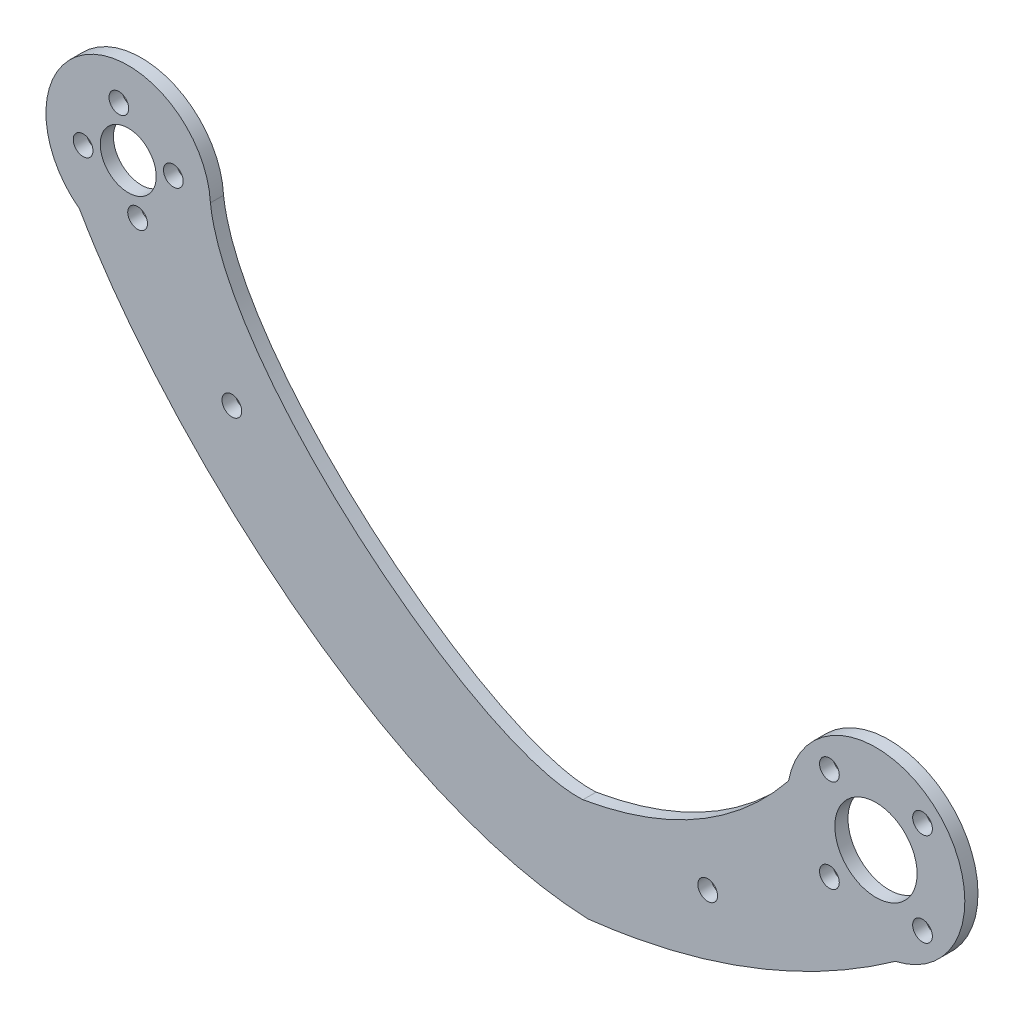
ISO-10303-21;
HEADER;
FILE_DESCRIPTION(('STEP AP214'),'2;1');
FILE_NAME('part.step','',(''),(''),'','','');
FILE_SCHEMA(('AUTOMOTIVE_DESIGN { 1 0 10303 214 1 1 1 1 }'));
ENDSEC;
DATA;
#1=APPLICATION_CONTEXT('core data for automotive mechanical design processes');
#2=APPLICATION_PROTOCOL_DEFINITION('international standard','automotive_design',2000,#1);
#3=PRODUCT_CONTEXT('',#1,'mechanical');
#4=PRODUCT('Part','Part','',(#3));
#5=PRODUCT_RELATED_PRODUCT_CATEGORY('part','',(#4));
#6=PRODUCT_DEFINITION_FORMATION('','',#4);
#7=PRODUCT_DEFINITION_CONTEXT('part definition',#1,'design');
#8=PRODUCT_DEFINITION('design','',#6,#7);
#9=PRODUCT_DEFINITION_SHAPE('','',#8);
#10=(LENGTH_UNIT() NAMED_UNIT(*) SI_UNIT(.MILLI.,.METRE.));
#11=(NAMED_UNIT(*) PLANE_ANGLE_UNIT() SI_UNIT($,.RADIAN.));
#12=(NAMED_UNIT(*) SI_UNIT($,.STERADIAN.) SOLID_ANGLE_UNIT());
#13=UNCERTAINTY_MEASURE_WITH_UNIT(LENGTH_MEASURE(1.E-05),#10,'distance_accuracy_value','');
#14=(GEOMETRIC_REPRESENTATION_CONTEXT(3) GLOBAL_UNCERTAINTY_ASSIGNED_CONTEXT((#13)) GLOBAL_UNIT_ASSIGNED_CONTEXT((#10,
#11,#12)) REPRESENTATION_CONTEXT('',''));
#15=CARTESIAN_POINT('',(0.,0.,0.));
#16=DIRECTION('',(0.,0.,1.));
#17=DIRECTION('',(1.,0.,0.));
#18=AXIS2_PLACEMENT_3D('',#15,#16,#17);
#19=CARTESIAN_POINT('',(5.89271121734806,-11.0238811000908,2.));
#20=CARTESIAN_POINT('',(-16.2082829222259,-27.8197472460681,2.));
#21=CARTESIAN_POINT('',(-43.7150317978709,-30.941916125743,2.));
#22=B_SPLINE_CURVE_WITH_KNOTS('',2,(#19,#20,#21),.UNSPECIFIED.,.F.,.F.,(3,3),(0.,1.),.UNSPECIFIED.);
#23=DIRECTION('',(0.,0.,-1.));
#24=VECTOR('',#23,1.);
#25=SURFACE_OF_LINEAR_EXTRUSION('',#22,#24);
#26=CARTESIAN_POINT('',(5.89271121734806,-11.0238811000908,0.));
#27=CARTESIAN_POINT('',(-16.2082829222259,-27.8197472460681,0.));
#28=CARTESIAN_POINT('',(-43.7150317978709,-30.941916125743,0.));
#29=B_SPLINE_CURVE_WITH_KNOTS('',2,(#26,#27,#28),.UNSPECIFIED.,.F.,.F.,(3,3),(0.,1.),.UNSPECIFIED.);
#30=CARTESIAN_POINT('',(2.96847581375117,-13.169591920146,0.));
#31=VERTEX_POINT('',#30);
#32=CARTESIAN_POINT('',(-43.7150317978709,-30.941916125743,0.));
#33=VERTEX_POINT('',#32);
#34=EDGE_CURVE('E145',#31,#33,#29,.T.);
#35=ORIENTED_EDGE('',*,*,#34,.F.);
#36=DIRECTION('',(0.,0.,-1.));
#37=VECTOR('',#36,1.);
#38=CARTESIAN_POINT('',(2.96847581375117,-13.169591920146,2.));
#39=LINE('',#38,#37);
#40=CARTESIAN_POINT('',(2.96847581375117,-13.169591920146,2.));
#41=VERTEX_POINT('',#40);
#42=EDGE_CURVE('E11',#41,#31,#39,.T.);
#43=ORIENTED_EDGE('',*,*,#42,.F.);
#44=CARTESIAN_POINT('',(-43.7150317978709,-30.941916125743,2.));
#45=VERTEX_POINT('',#44);
#46=EDGE_CURVE('E177',#41,#45,#22,.T.);
#47=ORIENTED_EDGE('',*,*,#46,.T.);
#48=DIRECTION('',(0.,0.,-1.));
#49=VECTOR('',#48,1.);
#50=CARTESIAN_POINT('',(-43.7150317978709,-30.941916125743,2.));
#51=LINE('',#50,#49);
#52=EDGE_CURVE('E67',#45,#33,#51,.T.);
#53=ORIENTED_EDGE('',*,*,#52,.T.);
#54=EDGE_LOOP('',(#35,#43,#47,#53));
#55=FACE_BOUND('',#54,.T.);
#56=ADVANCED_FACE('F49',(#55),#25,.T.);
#57=CARTESIAN_POINT('',(0.,0.,2.));
#58=DIRECTION('',(0.,0.,-1.));
#59=DIRECTION('',(-1.,0.,0.));
#60=AXIS2_PLACEMENT_3D('',#57,#58,#59);
#61=CYLINDRICAL_SURFACE('',#60,13.5);
#62=CARTESIAN_POINT('',(0.,0.,0.));
#63=DIRECTION('',(0.,0.,1.));
#64=DIRECTION('',(1.,0.,0.));
#65=AXIS2_PLACEMENT_3D('',#62,#63,#64);
#66=CIRCLE('',#65,13.5);
#67=CARTESIAN_POINT('',(-13.2764107451434,2.44681787762002,0.));
#68=VERTEX_POINT('',#67);
#69=EDGE_CURVE('E325',#31,#68,#66,.T.);
#70=ORIENTED_EDGE('',*,*,#69,.T.);
#71=DIRECTION('',(0.,0.,-1.));
#72=VECTOR('',#71,1.);
#73=CARTESIAN_POINT('',(-13.2764107451434,2.44681787762002,2.));
#74=LINE('',#73,#72);
#75=CARTESIAN_POINT('',(-13.2764107451434,2.44681787762002,2.));
#76=VERTEX_POINT('',#75);
#77=EDGE_CURVE('E59',#76,#68,#74,.T.);
#78=ORIENTED_EDGE('',*,*,#77,.F.);
#79=CARTESIAN_POINT('',(0.,0.,2.));
#80=DIRECTION('',(0.,0.,1.));
#81=DIRECTION('',(1.,0.,0.));
#82=AXIS2_PLACEMENT_3D('',#79,#80,#81);
#83=CIRCLE('',#82,13.5);
#84=EDGE_CURVE('E172',#41,#76,#83,.T.);
#85=ORIENTED_EDGE('',*,*,#84,.F.);
#86=ORIENTED_EDGE('',*,*,#42,.T.);
#87=EDGE_LOOP('',(#70,#78,#85,#86));
#88=FACE_BOUND('',#87,.T.);
#89=ADVANCED_FACE('F165',(#88),#61,.T.);
#90=CARTESIAN_POINT('',(-44.5148949759072,-15.6481190292885,2.));
#91=CARTESIAN_POINT('',(-23.7549924871948,-12.0499323994041,2.));
#92=CARTESIAN_POINT('',(-11.6175816478134,4.61321977109147,2.));
#93=B_SPLINE_CURVE_WITH_KNOTS('',2,(#90,#91,#92),.UNSPECIFIED.,.F.,.F.,(3,3),(0.,1.),.UNSPECIFIED.);
#94=DIRECTION('',(0.,0.,-1.));
#95=VECTOR('',#94,1.);
#96=SURFACE_OF_LINEAR_EXTRUSION('',#93,#95);
#97=CARTESIAN_POINT('',(-44.5148949759072,-15.6481190292885,0.));
#98=CARTESIAN_POINT('',(-23.7549924871948,-12.0499323994041,0.));
#99=CARTESIAN_POINT('',(-11.6175816478134,4.61321977109147,0.));
#100=B_SPLINE_CURVE_WITH_KNOTS('',2,(#97,#98,#99),.UNSPECIFIED.,.F.,.F.,(3,3),(0.,1.),.UNSPECIFIED.);
#101=CARTESIAN_POINT('',(-44.5148949759072,-15.6481190292885,0.));
#102=VERTEX_POINT('',#101);
#103=EDGE_CURVE('E349',#102,#68,#100,.T.);
#104=ORIENTED_EDGE('',*,*,#103,.F.);
#105=DIRECTION('',(0.,0.,-1.));
#106=VECTOR('',#105,1.);
#107=CARTESIAN_POINT('',(-44.5148949759072,-15.6481190292885,2.));
#108=LINE('',#107,#106);
#109=CARTESIAN_POINT('',(-44.5148949759072,-15.6481190292885,2.));
#110=VERTEX_POINT('',#109);
#111=EDGE_CURVE('E126',#110,#102,#108,.T.);
#112=ORIENTED_EDGE('',*,*,#111,.F.);
#113=EDGE_CURVE('E114',#110,#76,#93,.T.);
#114=ORIENTED_EDGE('',*,*,#113,.T.);
#115=ORIENTED_EDGE('',*,*,#77,.T.);
#116=EDGE_LOOP('',(#104,#112,#114,#115));
#117=FACE_BOUND('',#116,.T.);
#118=ADVANCED_FACE('F163',(#117),#96,.T.);
#119=CARTESIAN_POINT('',(-44.5148949759072,-15.6481190292885,2.));
#120=CARTESIAN_POINT('',(-60.4932461919799,-16.6209660956188,2.));
#121=CARTESIAN_POINT('',(-98.7193744847428,13.9940161599674,2.));
#122=CARTESIAN_POINT('',(-101.09932332728,34.5772843276964,2.));
#123=B_SPLINE_CURVE_WITH_KNOTS('',3,(#119,#120,#121,#122),.UNSPECIFIED.,.F.,.F.,(4,4),(0.,1.),.UNSPECIFIED.);
#124=DIRECTION('',(0.,0.,-1.));
#125=VECTOR('',#124,1.);
#126=SURFACE_OF_LINEAR_EXTRUSION('',#123,#125);
#127=CARTESIAN_POINT('',(-44.5148949759072,-15.6481190292885,0.));
#128=CARTESIAN_POINT('',(-60.4932461919799,-16.6209660956188,0.));
#129=CARTESIAN_POINT('',(-98.7193744847428,13.9940161599674,0.));
#130=CARTESIAN_POINT('',(-101.09932332728,34.5772843276964,0.));
#131=B_SPLINE_CURVE_WITH_KNOTS('',3,(#127,#128,#129,#130),.UNSPECIFIED.,.F.,.F.,(4,4),(0.,1.),.UNSPECIFIED.);
#132=CARTESIAN_POINT('',(-101.09932332728,34.5772843276964,0.));
#133=VERTEX_POINT('',#132);
#134=EDGE_CURVE('E122',#102,#133,#131,.T.);
#135=ORIENTED_EDGE('',*,*,#134,.T.);
#136=DIRECTION('',(0.,0.,-1.));
#137=VECTOR('',#136,1.);
#138=CARTESIAN_POINT('',(-101.09932332728,34.5772843276964,2.));
#139=LINE('',#138,#137);
#140=CARTESIAN_POINT('',(-101.09932332728,34.5772843276964,2.));
#141=VERTEX_POINT('',#140);
#142=EDGE_CURVE('E119',#141,#133,#139,.T.);
#143=ORIENTED_EDGE('',*,*,#142,.F.);
#144=EDGE_CURVE('E106',#110,#141,#123,.T.);
#145=ORIENTED_EDGE('',*,*,#144,.F.);
#146=ORIENTED_EDGE('',*,*,#111,.T.);
#147=EDGE_LOOP('',(#135,#143,#145,#146));
#148=FACE_BOUND('',#147,.T.);
#149=ADVANCED_FACE('F120',(#148),#126,.F.);
#150=CARTESIAN_POINT('',(-113.582262858622,33.92442855736,2.));
#151=DIRECTION('',(0.,0.,-1.));
#152=DIRECTION('',(-1.,0.,0.));
#153=AXIS2_PLACEMENT_3D('',#150,#151,#152);
#154=CYLINDRICAL_SURFACE('',#153,12.5);
#155=CARTESIAN_POINT('',(-113.582262858622,33.92442855736,0.));
#156=DIRECTION('',(0.,0.,1.));
#157=DIRECTION('',(1.,0.,0.));
#158=AXIS2_PLACEMENT_3D('',#155,#156,#157);
#159=CIRCLE('',#158,12.5);
#160=CARTESIAN_POINT('',(-120.988196927905,23.8545655711311,0.));
#161=VERTEX_POINT('',#160);
#162=EDGE_CURVE('E328',#133,#161,#159,.T.);
#163=ORIENTED_EDGE('',*,*,#162,.T.);
#164=DIRECTION('',(0.,0.,-1.));
#165=VECTOR('',#164,1.);
#166=CARTESIAN_POINT('',(-120.988196927905,23.8545655711311,2.));
#167=LINE('',#166,#165);
#168=CARTESIAN_POINT('',(-120.988196927905,23.8545655711311,2.));
#169=VERTEX_POINT('',#168);
#170=EDGE_CURVE('E87',#169,#161,#167,.T.);
#171=ORIENTED_EDGE('',*,*,#170,.F.);
#172=CARTESIAN_POINT('',(-113.582262858622,33.92442855736,2.));
#173=DIRECTION('',(0.,0.,1.));
#174=DIRECTION('',(1.,0.,0.));
#175=AXIS2_PLACEMENT_3D('',#172,#173,#174);
#176=CIRCLE('',#175,12.5);
#177=EDGE_CURVE('E112',#141,#169,#176,.T.);
#178=ORIENTED_EDGE('',*,*,#177,.F.);
#179=ORIENTED_EDGE('',*,*,#142,.T.);
#180=EDGE_LOOP('',(#163,#171,#178,#179));
#181=FACE_BOUND('',#180,.T.);
#182=ADVANCED_FACE('F128',(#181),#154,.T.);
#183=CARTESIAN_POINT('',(-43.7150317978709,-30.941916125743,2.));
#184=CARTESIAN_POINT('',(-74.6558875999215,-29.7721762631503,2.));
#185=CARTESIAN_POINT('',(-107.934743733726,0.909272839135125,2.));
#186=CARTESIAN_POINT('',(-120.988196927905,23.8545655711311,2.));
#187=B_SPLINE_CURVE_WITH_KNOTS('',3,(#183,#184,#185,#186),.UNSPECIFIED.,.F.,.F.,(4,4),(0.,1.),.UNSPECIFIED.);
#188=DIRECTION('',(0.,0.,-1.));
#189=VECTOR('',#188,1.);
#190=SURFACE_OF_LINEAR_EXTRUSION('',#187,#189);
#191=CARTESIAN_POINT('',(-43.7150317978709,-30.941916125743,0.));
#192=CARTESIAN_POINT('',(-74.6558875999215,-29.7721762631503,0.));
#193=CARTESIAN_POINT('',(-107.934743733726,0.909272839135125,0.));
#194=CARTESIAN_POINT('',(-120.988196927905,23.8545655711311,0.));
#195=B_SPLINE_CURVE_WITH_KNOTS('',3,(#191,#192,#193,#194),.UNSPECIFIED.,.F.,.F.,(4,4),(0.,1.),.UNSPECIFIED.);
#196=EDGE_CURVE('E183',#33,#161,#195,.T.);
#197=ORIENTED_EDGE('',*,*,#196,.F.);
#198=ORIENTED_EDGE('',*,*,#52,.F.);
#199=EDGE_CURVE('E130',#45,#169,#187,.T.);
#200=ORIENTED_EDGE('',*,*,#199,.T.);
#201=ORIENTED_EDGE('',*,*,#170,.T.);
#202=EDGE_LOOP('',(#197,#198,#200,#201));
#203=FACE_BOUND('',#202,.T.);
#204=ADVANCED_FACE('F153',(#203),#190,.T.);
#205=CARTESIAN_POINT('',(0.,0.,2.));
#206=DIRECTION('',(0.,0.,1.));
#207=DIRECTION('',(1.,0.,0.));
#208=AXIS2_PLACEMENT_3D('',#205,#206,#207);
#209=PLANE('',#208);
#210=CARTESIAN_POINT('',(-97.8402350611844,9.54296842905933,2.));
#211=DIRECTION('',(0.,0.,1.));
#212=DIRECTION('',(1.,0.,0.));
#213=AXIS2_PLACEMENT_3D('',#210,#211,#212);
#214=CIRCLE('',#213,1.5);
#215=CARTESIAN_POINT('',(-96.3402350611844,9.54296842905933,2.));
#216=VERTEX_POINT('',#215);
#217=EDGE_CURVE('E201',#216,#216,#214,.T.);
#218=ORIENTED_EDGE('',*,*,#217,.F.);
#219=EDGE_LOOP('',(#218));
#220=FACE_BOUND('',#219,.T.);
#221=CARTESIAN_POINT('',(-25.5617243230472,-18.0513040104756,2.));
#222=DIRECTION('',(0.,0.,1.));
#223=DIRECTION('',(1.,0.,0.));
#224=AXIS2_PLACEMENT_3D('',#221,#222,#223);
#225=CIRCLE('',#224,1.5);
#226=CARTESIAN_POINT('',(-24.0617243230472,-18.0513040104756,2.));
#227=VERTEX_POINT('',#226);
#228=EDGE_CURVE('E267',#227,#227,#225,.T.);
#229=ORIENTED_EDGE('',*,*,#228,.F.);
#230=EDGE_LOOP('',(#229));
#231=FACE_BOUND('',#230,.T.);
#232=CARTESIAN_POINT('',(-120.435814162853,32.5000569344794,2.));
#233=DIRECTION('',(0.,0.,1.));
#234=DIRECTION('',(1.,0.,0.));
#235=AXIS2_PLACEMENT_3D('',#232,#233,#234);
#236=CIRCLE('',#235,1.5);
#237=CARTESIAN_POINT('',(-118.935814162853,32.5000569344794,2.));
#238=VERTEX_POINT('',#237);
#239=EDGE_CURVE('E196',#238,#238,#236,.T.);
#240=ORIENTED_EDGE('',*,*,#239,.F.);
#241=EDGE_LOOP('',(#240));
#242=FACE_BOUND('',#241,.T.);
#243=CARTESIAN_POINT('',(-7.07106781186529,7.07106781186637,2.));
#244=DIRECTION('',(0.,0.,1.));
#245=DIRECTION('',(1.,0.,0.));
#246=AXIS2_PLACEMENT_3D('',#243,#244,#245);
#247=CIRCLE('',#246,1.5);
#248=CARTESIAN_POINT('',(-5.57106781186529,7.07106781186637,2.));
#249=VERTEX_POINT('',#248);
#250=EDGE_CURVE('E230',#249,#249,#247,.T.);
#251=ORIENTED_EDGE('',*,*,#250,.F.);
#252=EDGE_LOOP('',(#251));
#253=FACE_BOUND('',#252,.T.);
#254=CARTESIAN_POINT('',(-113.582262858607,33.9244285573589,2.));
#255=DIRECTION('',(0.,0.,1.));
#256=DIRECTION('',(1.,0.,0.));
#257=AXIS2_PLACEMENT_3D('',#254,#255,#256);
#258=CIRCLE('',#257,4.24999999999548);
#259=CARTESIAN_POINT('',(-109.332262858612,33.9244285573589,2.));
#260=VERTEX_POINT('',#259);
#261=EDGE_CURVE('E222',#260,#260,#258,.T.);
#262=ORIENTED_EDGE('',*,*,#261,.F.);
#263=EDGE_LOOP('',(#262));
#264=FACE_BOUND('',#263,.T.);
#265=CARTESIAN_POINT('',(7.07106781186566,7.07106781186629,2.));
#266=DIRECTION('',(0.,0.,1.));
#267=DIRECTION('',(1.,0.,0.));
#268=AXIS2_PLACEMENT_3D('',#265,#266,#267);
#269=CIRCLE('',#268,1.5);
#270=CARTESIAN_POINT('',(8.57106781186566,7.07106781186629,2.));
#271=VERTEX_POINT('',#270);
#272=EDGE_CURVE('E214',#271,#271,#269,.T.);
#273=ORIENTED_EDGE('',*,*,#272,.F.);
#274=EDGE_LOOP('',(#273));
#275=FACE_BOUND('',#274,.T.);
#276=CARTESIAN_POINT('',(7.07106781186539,-7.07106781186556,2.));
#277=DIRECTION('',(0.,0.,1.));
#278=DIRECTION('',(1.,0.,0.));
#279=AXIS2_PLACEMENT_3D('',#276,#277,#278);
#280=CIRCLE('',#279,1.5);
#281=CARTESIAN_POINT('',(8.57106781186539,-7.07106781186556,2.));
#282=VERTEX_POINT('',#281);
#283=EDGE_CURVE('E205',#282,#282,#280,.T.);
#284=ORIENTED_EDGE('',*,*,#283,.F.);
#285=EDGE_LOOP('',(#284));
#286=FACE_BOUND('',#285,.T.);
#287=CARTESIAN_POINT('',(-7.07106781186559,-7.07106781186536,2.));
#288=DIRECTION('',(0.,0.,1.));
#289=DIRECTION('',(1.,0.,0.));
#290=AXIS2_PLACEMENT_3D('',#287,#288,#289);
#291=CIRCLE('',#290,1.5);
#292=CARTESIAN_POINT('',(-5.57106781186559,-7.07106781186536,2.));
#293=VERTEX_POINT('',#292);
#294=EDGE_CURVE('E260',#293,#293,#291,.T.);
#295=ORIENTED_EDGE('',*,*,#294,.F.);
#296=EDGE_LOOP('',(#295));
#297=FACE_BOUND('',#296,.T.);
#298=CARTESIAN_POINT('',(-106.728711554361,35.3488001802385,2.));
#299=DIRECTION('',(0.,0.,1.));
#300=DIRECTION('',(1.,0.,0.));
#301=AXIS2_PLACEMENT_3D('',#298,#299,#300);
#302=CIRCLE('',#301,1.5);
#303=CARTESIAN_POINT('',(-105.228711554361,35.3488001802385,2.));
#304=VERTEX_POINT('',#303);
#305=EDGE_CURVE('E252',#304,#304,#302,.T.);
#306=ORIENTED_EDGE('',*,*,#305,.F.);
#307=EDGE_LOOP('',(#306));
#308=FACE_BOUND('',#307,.T.);
#309=CARTESIAN_POINT('',(-115.006634481487,40.7779798616052,2.));
#310=DIRECTION('',(0.,0.,1.));
#311=DIRECTION('',(1.,0.,0.));
#312=AXIS2_PLACEMENT_3D('',#309,#310,#311);
#313=CIRCLE('',#312,1.5);
#314=CARTESIAN_POINT('',(-113.506634481487,40.7779798616052,2.));
#315=VERTEX_POINT('',#314);
#316=EDGE_CURVE('E244',#315,#315,#313,.T.);
#317=ORIENTED_EDGE('',*,*,#316,.F.);
#318=EDGE_LOOP('',(#317));
#319=FACE_BOUND('',#318,.T.);
#320=CARTESIAN_POINT('',(-112.157891235728,27.0708772531127,2.));
#321=DIRECTION('',(0.,0.,1.));
#322=DIRECTION('',(1.,0.,0.));
#323=AXIS2_PLACEMENT_3D('',#320,#321,#322);
#324=CIRCLE('',#323,1.5);
#325=CARTESIAN_POINT('',(-110.657891235728,27.0708772531127,2.));
#326=VERTEX_POINT('',#325);
#327=EDGE_CURVE('E204',#326,#326,#324,.T.);
#328=ORIENTED_EDGE('',*,*,#327,.F.);
#329=EDGE_LOOP('',(#328));
#330=FACE_BOUND('',#329,.T.);
#331=CARTESIAN_POINT('',(1.47017814589034E-13,8.54784992787572E-13,2.));
#332=DIRECTION('',(0.,0.,1.));
#333=DIRECTION('',(1.,0.,0.));
#334=AXIS2_PLACEMENT_3D('',#331,#332,#333);
#335=CIRCLE('',#334,6.25000000000001);
#336=CARTESIAN_POINT('',(6.25000000000016,8.54784992787572E-13,2.));
#337=VERTEX_POINT('',#336);
#338=EDGE_CURVE('E191',#337,#337,#335,.T.);
#339=ORIENTED_EDGE('',*,*,#338,.F.);
#340=EDGE_LOOP('',(#339));
#341=FACE_BOUND('',#340,.T.);
#342=ORIENTED_EDGE('',*,*,#46,.F.);
#343=ORIENTED_EDGE('',*,*,#84,.T.);
#344=ORIENTED_EDGE('',*,*,#113,.F.);
#345=ORIENTED_EDGE('',*,*,#144,.T.);
#346=ORIENTED_EDGE('',*,*,#177,.T.);
#347=ORIENTED_EDGE('',*,*,#199,.F.);
#348=EDGE_LOOP('',(#342,#343,#344,#345,#346,#347));
#349=FACE_BOUND('',#348,.T.);
#350=ADVANCED_FACE('F109',(#220,#231,#242,#253,#264,#275,#286,#297,#308,#319,#330,#341,#349),
#209,.T.);
#351=CARTESIAN_POINT('',(0.,0.,0.));
#352=DIRECTION('',(0.,0.,1.));
#353=DIRECTION('',(1.,0.,0.));
#354=AXIS2_PLACEMENT_3D('',#351,#352,#353);
#355=PLANE('',#354);
#356=CARTESIAN_POINT('',(-97.8402350611844,9.54296842905933,0.));
#357=DIRECTION('',(0.,0.,1.));
#358=DIRECTION('',(1.,0.,0.));
#359=AXIS2_PLACEMENT_3D('',#356,#357,#358);
#360=CIRCLE('',#359,1.5);
#361=CARTESIAN_POINT('',(-96.3402350611844,9.54296842905933,0.));
#362=VERTEX_POINT('',#361);
#363=EDGE_CURVE('E275',#362,#362,#360,.T.);
#364=ORIENTED_EDGE('',*,*,#363,.T.);
#365=EDGE_LOOP('',(#364));
#366=FACE_BOUND('',#365,.T.);
#367=CARTESIAN_POINT('',(-25.5617243230472,-18.0513040104756,0.));
#368=DIRECTION('',(0.,0.,1.));
#369=DIRECTION('',(1.,0.,0.));
#370=AXIS2_PLACEMENT_3D('',#367,#368,#369);
#371=CIRCLE('',#370,1.5);
#372=CARTESIAN_POINT('',(-24.0617243230472,-18.0513040104756,0.));
#373=VERTEX_POINT('',#372);
#374=EDGE_CURVE('E271',#373,#373,#371,.T.);
#375=ORIENTED_EDGE('',*,*,#374,.T.);
#376=EDGE_LOOP('',(#375));
#377=FACE_BOUND('',#376,.T.);
#378=CARTESIAN_POINT('',(-120.435814162853,32.5000569344794,0.));
#379=DIRECTION('',(0.,0.,1.));
#380=DIRECTION('',(1.,0.,0.));
#381=AXIS2_PLACEMENT_3D('',#378,#379,#380);
#382=CIRCLE('',#381,1.5);
#383=CARTESIAN_POINT('',(-118.935814162853,32.5000569344794,0.));
#384=VERTEX_POINT('',#383);
#385=EDGE_CURVE('E200',#384,#384,#382,.T.);
#386=ORIENTED_EDGE('',*,*,#385,.T.);
#387=EDGE_LOOP('',(#386));
#388=FACE_BOUND('',#387,.T.);
#389=CARTESIAN_POINT('',(-7.07106781186529,7.07106781186637,0.));
#390=DIRECTION('',(0.,0.,1.));
#391=DIRECTION('',(1.,0.,0.));
#392=AXIS2_PLACEMENT_3D('',#389,#390,#391);
#393=CIRCLE('',#392,1.5);
#394=CARTESIAN_POINT('',(-5.57106781186529,7.07106781186637,0.));
#395=VERTEX_POINT('',#394);
#396=EDGE_CURVE('E192',#395,#395,#393,.T.);
#397=ORIENTED_EDGE('',*,*,#396,.T.);
#398=EDGE_LOOP('',(#397));
#399=FACE_BOUND('',#398,.T.);
#400=CARTESIAN_POINT('',(-113.582262858607,33.9244285573589,0.));
#401=DIRECTION('',(0.,0.,1.));
#402=DIRECTION('',(1.,0.,0.));
#403=AXIS2_PLACEMENT_3D('',#400,#401,#402);
#404=CIRCLE('',#403,4.24999999999548);
#405=CARTESIAN_POINT('',(-109.332262858612,33.9244285573589,0.));
#406=VERTEX_POINT('',#405);
#407=EDGE_CURVE('E226',#406,#406,#404,.T.);
#408=ORIENTED_EDGE('',*,*,#407,.T.);
#409=EDGE_LOOP('',(#408));
#410=FACE_BOUND('',#409,.T.);
#411=CARTESIAN_POINT('',(7.07106781186566,7.07106781186629,0.));
#412=DIRECTION('',(0.,0.,1.));
#413=DIRECTION('',(1.,0.,0.));
#414=AXIS2_PLACEMENT_3D('',#411,#412,#413);
#415=CIRCLE('',#414,1.5);
#416=CARTESIAN_POINT('',(8.57106781186566,7.07106781186629,0.));
#417=VERTEX_POINT('',#416);
#418=EDGE_CURVE('E218',#417,#417,#415,.T.);
#419=ORIENTED_EDGE('',*,*,#418,.T.);
#420=EDGE_LOOP('',(#419));
#421=FACE_BOUND('',#420,.T.);
#422=CARTESIAN_POINT('',(7.07106781186539,-7.07106781186556,0.));
#423=DIRECTION('',(0.,0.,1.));
#424=DIRECTION('',(1.,0.,0.));
#425=AXIS2_PLACEMENT_3D('',#422,#423,#424);
#426=CIRCLE('',#425,1.5);
#427=CARTESIAN_POINT('',(8.57106781186539,-7.07106781186556,0.));
#428=VERTEX_POINT('',#427);
#429=EDGE_CURVE('E209',#428,#428,#426,.T.);
#430=ORIENTED_EDGE('',*,*,#429,.T.);
#431=EDGE_LOOP('',(#430));
#432=FACE_BOUND('',#431,.T.);
#433=CARTESIAN_POINT('',(-7.07106781186559,-7.07106781186536,0.));
#434=DIRECTION('',(0.,0.,1.));
#435=DIRECTION('',(1.,0.,0.));
#436=AXIS2_PLACEMENT_3D('',#433,#434,#435);
#437=CIRCLE('',#436,1.5);
#438=CARTESIAN_POINT('',(-5.57106781186559,-7.07106781186536,0.));
#439=VERTEX_POINT('',#438);
#440=EDGE_CURVE('E210',#439,#439,#437,.T.);
#441=ORIENTED_EDGE('',*,*,#440,.T.);
#442=EDGE_LOOP('',(#441));
#443=FACE_BOUND('',#442,.T.);
#444=CARTESIAN_POINT('',(-106.728711554361,35.3488001802385,0.));
#445=DIRECTION('',(0.,0.,1.));
#446=DIRECTION('',(1.,0.,0.));
#447=AXIS2_PLACEMENT_3D('',#444,#445,#446);
#448=CIRCLE('',#447,1.5);
#449=CARTESIAN_POINT('',(-105.228711554361,35.3488001802385,0.));
#450=VERTEX_POINT('',#449);
#451=EDGE_CURVE('E256',#450,#450,#448,.T.);
#452=ORIENTED_EDGE('',*,*,#451,.T.);
#453=EDGE_LOOP('',(#452));
#454=FACE_BOUND('',#453,.T.);
#455=CARTESIAN_POINT('',(-115.006634481487,40.7779798616052,0.));
#456=DIRECTION('',(0.,0.,1.));
#457=DIRECTION('',(1.,0.,0.));
#458=AXIS2_PLACEMENT_3D('',#455,#456,#457);
#459=CIRCLE('',#458,1.5);
#460=CARTESIAN_POINT('',(-113.506634481487,40.7779798616052,0.));
#461=VERTEX_POINT('',#460);
#462=EDGE_CURVE('E248',#461,#461,#459,.T.);
#463=ORIENTED_EDGE('',*,*,#462,.T.);
#464=EDGE_LOOP('',(#463));
#465=FACE_BOUND('',#464,.T.);
#466=CARTESIAN_POINT('',(-112.157891235728,27.0708772531127,0.));
#467=DIRECTION('',(0.,0.,1.));
#468=DIRECTION('',(1.,0.,0.));
#469=AXIS2_PLACEMENT_3D('',#466,#467,#468);
#470=CIRCLE('',#469,1.5);
#471=CARTESIAN_POINT('',(-110.657891235728,27.0708772531127,0.));
#472=VERTEX_POINT('',#471);
#473=EDGE_CURVE('E240',#472,#472,#470,.T.);
#474=ORIENTED_EDGE('',*,*,#473,.T.);
#475=EDGE_LOOP('',(#474));
#476=FACE_BOUND('',#475,.T.);
#477=CARTESIAN_POINT('',(1.47017814589034E-13,8.54784992787572E-13,0.));
#478=DIRECTION('',(0.,0.,1.));
#479=DIRECTION('',(1.,0.,0.));
#480=AXIS2_PLACEMENT_3D('',#477,#478,#479);
#481=CIRCLE('',#480,6.25000000000001);
#482=CARTESIAN_POINT('',(6.25000000000016,8.54784992787572E-13,0.));
#483=VERTEX_POINT('',#482);
#484=EDGE_CURVE('E184',#483,#483,#481,.T.);
#485=ORIENTED_EDGE('',*,*,#484,.T.);
#486=EDGE_LOOP('',(#485));
#487=FACE_BOUND('',#486,.T.);
#488=ORIENTED_EDGE('',*,*,#34,.T.);
#489=ORIENTED_EDGE('',*,*,#196,.T.);
#490=ORIENTED_EDGE('',*,*,#162,.F.);
#491=ORIENTED_EDGE('',*,*,#134,.F.);
#492=ORIENTED_EDGE('',*,*,#103,.T.);
#493=ORIENTED_EDGE('',*,*,#69,.F.);
#494=EDGE_LOOP('',(#488,#489,#490,#491,#492,#493));
#495=FACE_BOUND('',#494,.T.);
#496=ADVANCED_FACE('F157',(#366,#377,#388,#399,#410,#421,#432,#443,#454,#465,#476,#487,#495),
#355,.F.);
#497=CARTESIAN_POINT('',(1.47017814589034E-13,8.54784992787572E-13,2.));
#498=DIRECTION('',(0.,0.,-1.));
#499=DIRECTION('',(-1.,0.,0.));
#500=AXIS2_PLACEMENT_3D('',#497,#498,#499);
#501=CYLINDRICAL_SURFACE('',#500,6.25000000000001);
#502=ORIENTED_EDGE('',*,*,#338,.T.);
#503=EDGE_LOOP('',(#502));
#504=FACE_BOUND('',#503,.T.);
#505=ORIENTED_EDGE('',*,*,#484,.F.);
#506=EDGE_LOOP('',(#505));
#507=FACE_BOUND('',#506,.T.);
#508=ADVANCED_FACE('F311',(#504,#507),#501,.F.);
#509=CARTESIAN_POINT('',(-112.157891235728,27.0708772531127,2.));
#510=DIRECTION('',(0.,0.,-1.));
#511=DIRECTION('',(-1.,0.,0.));
#512=AXIS2_PLACEMENT_3D('',#509,#510,#511);
#513=CYLINDRICAL_SURFACE('',#512,1.5);
#514=ORIENTED_EDGE('',*,*,#327,.T.);
#515=EDGE_LOOP('',(#514));
#516=FACE_BOUND('',#515,.T.);
#517=ORIENTED_EDGE('',*,*,#473,.F.);
#518=EDGE_LOOP('',(#517));
#519=FACE_BOUND('',#518,.T.);
#520=ADVANCED_FACE('F314',(#516,#519),#513,.F.);
#521=CARTESIAN_POINT('',(-115.006634481487,40.7779798616052,2.));
#522=DIRECTION('',(0.,0.,-1.));
#523=DIRECTION('',(-1.,0.,0.));
#524=AXIS2_PLACEMENT_3D('',#521,#522,#523);
#525=CYLINDRICAL_SURFACE('',#524,1.5);
#526=ORIENTED_EDGE('',*,*,#316,.T.);
#527=EDGE_LOOP('',(#526));
#528=FACE_BOUND('',#527,.T.);
#529=ORIENTED_EDGE('',*,*,#462,.F.);
#530=EDGE_LOOP('',(#529));
#531=FACE_BOUND('',#530,.T.);
#532=ADVANCED_FACE('F434',(#528,#531),#525,.F.);
#533=CARTESIAN_POINT('',(-106.728711554361,35.3488001802385,2.));
#534=DIRECTION('',(0.,0.,-1.));
#535=DIRECTION('',(-1.,0.,0.));
#536=AXIS2_PLACEMENT_3D('',#533,#534,#535);
#537=CYLINDRICAL_SURFACE('',#536,1.5);
#538=ORIENTED_EDGE('',*,*,#305,.T.);
#539=EDGE_LOOP('',(#538));
#540=FACE_BOUND('',#539,.T.);
#541=ORIENTED_EDGE('',*,*,#451,.F.);
#542=EDGE_LOOP('',(#541));
#543=FACE_BOUND('',#542,.T.);
#544=ADVANCED_FACE('F441',(#540,#543),#537,.F.);
#545=CARTESIAN_POINT('',(-7.07106781186559,-7.07106781186536,2.));
#546=DIRECTION('',(0.,0.,-1.));
#547=DIRECTION('',(-1.,0.,0.));
#548=AXIS2_PLACEMENT_3D('',#545,#546,#547);
#549=CYLINDRICAL_SURFACE('',#548,1.5);
#550=ORIENTED_EDGE('',*,*,#294,.T.);
#551=EDGE_LOOP('',(#550));
#552=FACE_BOUND('',#551,.T.);
#553=ORIENTED_EDGE('',*,*,#440,.F.);
#554=EDGE_LOOP('',(#553));
#555=FACE_BOUND('',#554,.T.);
#556=ADVANCED_FACE('F448',(#552,#555),#549,.F.);
#557=CARTESIAN_POINT('',(7.07106781186539,-7.07106781186556,2.));
#558=DIRECTION('',(0.,0.,-1.));
#559=DIRECTION('',(-1.,0.,0.));
#560=AXIS2_PLACEMENT_3D('',#557,#558,#559);
#561=CYLINDRICAL_SURFACE('',#560,1.5);
#562=ORIENTED_EDGE('',*,*,#283,.T.);
#563=EDGE_LOOP('',(#562));
#564=FACE_BOUND('',#563,.T.);
#565=ORIENTED_EDGE('',*,*,#429,.F.);
#566=EDGE_LOOP('',(#565));
#567=FACE_BOUND('',#566,.T.);
#568=ADVANCED_FACE('F455',(#564,#567),#561,.F.);
#569=CARTESIAN_POINT('',(7.07106781186566,7.07106781186629,2.));
#570=DIRECTION('',(0.,0.,-1.));
#571=DIRECTION('',(-1.,0.,0.));
#572=AXIS2_PLACEMENT_3D('',#569,#570,#571);
#573=CYLINDRICAL_SURFACE('',#572,1.5);
#574=ORIENTED_EDGE('',*,*,#272,.T.);
#575=EDGE_LOOP('',(#574));
#576=FACE_BOUND('',#575,.T.);
#577=ORIENTED_EDGE('',*,*,#418,.F.);
#578=EDGE_LOOP('',(#577));
#579=FACE_BOUND('',#578,.T.);
#580=ADVANCED_FACE('F462',(#576,#579),#573,.F.);
#581=CARTESIAN_POINT('',(-113.582262858607,33.9244285573589,2.));
#582=DIRECTION('',(0.,0.,-1.));
#583=DIRECTION('',(-1.,0.,0.));
#584=AXIS2_PLACEMENT_3D('',#581,#582,#583);
#585=CYLINDRICAL_SURFACE('',#584,4.24999999999548);
#586=ORIENTED_EDGE('',*,*,#261,.T.);
#587=EDGE_LOOP('',(#586));
#588=FACE_BOUND('',#587,.T.);
#589=ORIENTED_EDGE('',*,*,#407,.F.);
#590=EDGE_LOOP('',(#589));
#591=FACE_BOUND('',#590,.T.);
#592=ADVANCED_FACE('F469',(#588,#591),#585,.F.);
#593=CARTESIAN_POINT('',(-7.07106781186529,7.07106781186637,2.));
#594=DIRECTION('',(0.,0.,-1.));
#595=DIRECTION('',(-1.,0.,0.));
#596=AXIS2_PLACEMENT_3D('',#593,#594,#595);
#597=CYLINDRICAL_SURFACE('',#596,1.5);
#598=ORIENTED_EDGE('',*,*,#250,.T.);
#599=EDGE_LOOP('',(#598));
#600=FACE_BOUND('',#599,.T.);
#601=ORIENTED_EDGE('',*,*,#396,.F.);
#602=EDGE_LOOP('',(#601));
#603=FACE_BOUND('',#602,.T.);
#604=ADVANCED_FACE('F476',(#600,#603),#597,.F.);
#605=CARTESIAN_POINT('',(-120.435814162853,32.5000569344794,2.));
#606=DIRECTION('',(0.,0.,-1.));
#607=DIRECTION('',(-1.,0.,0.));
#608=AXIS2_PLACEMENT_3D('',#605,#606,#607);
#609=CYLINDRICAL_SURFACE('',#608,1.5);
#610=ORIENTED_EDGE('',*,*,#239,.T.);
#611=EDGE_LOOP('',(#610));
#612=FACE_BOUND('',#611,.T.);
#613=ORIENTED_EDGE('',*,*,#385,.F.);
#614=EDGE_LOOP('',(#613));
#615=FACE_BOUND('',#614,.T.);
#616=ADVANCED_FACE('F483',(#612,#615),#609,.F.);
#617=CARTESIAN_POINT('',(-25.5617243230472,-18.0513040104756,2.));
#618=DIRECTION('',(0.,0.,-1.));
#619=DIRECTION('',(-1.,0.,0.));
#620=AXIS2_PLACEMENT_3D('',#617,#618,#619);
#621=CYLINDRICAL_SURFACE('',#620,1.5);
#622=ORIENTED_EDGE('',*,*,#228,.T.);
#623=EDGE_LOOP('',(#622));
#624=FACE_BOUND('',#623,.T.);
#625=ORIENTED_EDGE('',*,*,#374,.F.);
#626=EDGE_LOOP('',(#625));
#627=FACE_BOUND('',#626,.T.);
#628=ADVANCED_FACE('F490',(#624,#627),#621,.F.);
#629=CARTESIAN_POINT('',(-97.8402350611844,9.54296842905933,2.));
#630=DIRECTION('',(0.,0.,-1.));
#631=DIRECTION('',(-1.,0.,0.));
#632=AXIS2_PLACEMENT_3D('',#629,#630,#631);
#633=CYLINDRICAL_SURFACE('',#632,1.5);
#634=ORIENTED_EDGE('',*,*,#217,.T.);
#635=EDGE_LOOP('',(#634));
#636=FACE_BOUND('',#635,.T.);
#637=ORIENTED_EDGE('',*,*,#363,.F.);
#638=EDGE_LOOP('',(#637));
#639=FACE_BOUND('',#638,.T.);
#640=ADVANCED_FACE('F284',(#636,#639),#633,.F.);
#641=CLOSED_SHELL('',(#56,#89,#118,#149,#182,#204,#350,#496,#508,#520,#532,#544,#556,#568,#580,
#592,#604,#616,#628,#640));
#642=MANIFOLD_SOLID_BREP('B2',#641);
#643=ADVANCED_BREP_SHAPE_REPRESENTATION('',(#18,#642),#14);
#644=SHAPE_DEFINITION_REPRESENTATION(#9,#643);
ENDSEC;
END-ISO-10303-21;
